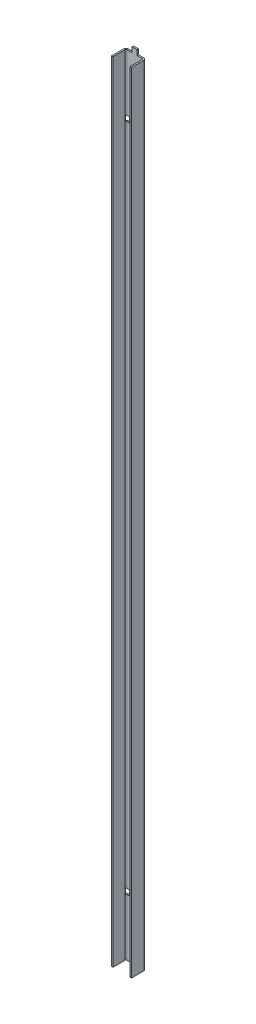
ISO-10303-21;
HEADER;
FILE_DESCRIPTION(('STEP AP214'),'2;1');
FILE_NAME('part.step','',(''),(''),'','','');
FILE_SCHEMA(('AUTOMOTIVE_DESIGN { 1 0 10303 214 1 1 1 1 }'));
ENDSEC;
DATA;
#1=APPLICATION_CONTEXT('core data for automotive mechanical design processes');
#2=APPLICATION_PROTOCOL_DEFINITION('international standard','automotive_design',2000,#1);
#3=PRODUCT_CONTEXT('',#1,'mechanical');
#4=PRODUCT('Part','Part','',(#3));
#5=PRODUCT_RELATED_PRODUCT_CATEGORY('part','',(#4));
#6=PRODUCT_DEFINITION_FORMATION('','',#4);
#7=PRODUCT_DEFINITION_CONTEXT('part definition',#1,'design');
#8=PRODUCT_DEFINITION('design','',#6,#7);
#9=PRODUCT_DEFINITION_SHAPE('','',#8);
#10=(LENGTH_UNIT() NAMED_UNIT(*) SI_UNIT(.MILLI.,.METRE.));
#11=(NAMED_UNIT(*) PLANE_ANGLE_UNIT() SI_UNIT($,.RADIAN.));
#12=(NAMED_UNIT(*) SI_UNIT($,.STERADIAN.) SOLID_ANGLE_UNIT());
#13=UNCERTAINTY_MEASURE_WITH_UNIT(LENGTH_MEASURE(1.E-05),#10,'distance_accuracy_value','');
#14=(GEOMETRIC_REPRESENTATION_CONTEXT(3) GLOBAL_UNCERTAINTY_ASSIGNED_CONTEXT((#13)) GLOBAL_UNIT_ASSIGNED_CONTEXT((#10,
#11,#12)) REPRESENTATION_CONTEXT('',''));
#15=CARTESIAN_POINT('',(0.,0.,0.));
#16=DIRECTION('',(0.,0.,1.));
#17=DIRECTION('',(1.,0.,0.));
#18=AXIS2_PLACEMENT_3D('',#15,#16,#17);
#19=CARTESIAN_POINT('',(1858.18296268255,394.,1.11022302462516E-13));
#20=DIRECTION('',(0.,0.,1.));
#21=DIRECTION('',(0.,-1.,0.));
#22=AXIS2_PLACEMENT_3D('',#19,#20,#21);
#23=PLANE('',#22);
#24=DIRECTION('',(0.,1.,0.));
#25=VECTOR('',#24,1.);
#26=CARTESIAN_POINT('',(284.,394.,0.));
#27=LINE('',#26,#25);
#28=CARTESIAN_POINT('',(284.,-393.5,0.));
#29=VERTEX_POINT('',#28);
#30=CARTESIAN_POINT('',(284.,393.5,0.));
#31=VERTEX_POINT('',#30);
#32=EDGE_CURVE('E114',#29,#31,#27,.T.);
#33=ORIENTED_EDGE('',*,*,#32,.F.);
#34=DIRECTION('',(-1.,0.,0.));
#35=VECTOR('',#34,1.);
#36=CARTESIAN_POINT('',(1858.18296268255,-393.5,0.));
#37=LINE('',#36,#35);
#38=CARTESIAN_POINT('',(285.5,-393.5,0.));
#39=VERTEX_POINT('',#38);
#40=EDGE_CURVE('E675',#39,#29,#37,.T.);
#41=ORIENTED_EDGE('',*,*,#40,.F.);
#42=DIRECTION('',(0.,1.,0.));
#43=VECTOR('',#42,1.);
#44=CARTESIAN_POINT('',(285.5,394.,0.));
#45=LINE('',#44,#43);
#46=CARTESIAN_POINT('',(285.5,393.5,1.11022302462516E-13));
#47=VERTEX_POINT('',#46);
#48=EDGE_CURVE('E90',#39,#47,#45,.T.);
#49=ORIENTED_EDGE('',*,*,#48,.T.);
#50=DIRECTION('',(-1.,0.,0.));
#51=VECTOR('',#50,1.);
#52=CARTESIAN_POINT('',(1858.18296268255,393.5,1.11022302462516E-13));
#53=LINE('',#52,#51);
#54=EDGE_CURVE('E107',#47,#31,#53,.T.);
#55=ORIENTED_EDGE('',*,*,#54,.T.);
#56=EDGE_LOOP('',(#33,#41,#49,#55));
#57=FACE_BOUND('',#56,.T.);
#58=ADVANCED_FACE('F65',(#57),#23,.T.);
#59=CARTESIAN_POINT('',(1858.18296268255,393.5,-11.9999999999999));
#60=DIRECTION('',(0.,-1.,0.));
#61=DIRECTION('',(0.,0.,-1.));
#62=AXIS2_PLACEMENT_3D('',#59,#60,#61);
#63=PLANE('',#62);
#64=DIRECTION('',(-1.,0.,0.));
#65=VECTOR('',#64,1.);
#66=CARTESIAN_POINT('',(1858.18296268255,393.5,-11.9999999999999));
#67=LINE('',#66,#65);
#68=CARTESIAN_POINT('',(285.5,393.5,-12.));
#69=VERTEX_POINT('',#68);
#70=CARTESIAN_POINT('',(284.,393.5,-11.9999999999999));
#71=VERTEX_POINT('',#70);
#72=EDGE_CURVE('E683',#69,#71,#67,.T.);
#73=ORIENTED_EDGE('',*,*,#72,.T.);
#74=DIRECTION('',(0.,0.,-1.));
#75=VECTOR('',#74,1.);
#76=CARTESIAN_POINT('',(284.,393.5,-12.));
#77=LINE('',#76,#75);
#78=EDGE_CURVE('E688',#31,#71,#77,.T.);
#79=ORIENTED_EDGE('',*,*,#78,.F.);
#80=ORIENTED_EDGE('',*,*,#54,.F.);
#81=DIRECTION('',(0.,0.,-1.));
#82=VECTOR('',#81,1.);
#83=CARTESIAN_POINT('',(285.5,393.5,-12.));
#84=LINE('',#83,#82);
#85=EDGE_CURVE('E13',#69,#47,#84,.F.);
#86=ORIENTED_EDGE('',*,*,#85,.F.);
#87=EDGE_LOOP('',(#73,#79,#80,#86));
#88=FACE_BOUND('',#87,.T.);
#89=ADVANCED_FACE('F851',(#88),#63,.F.);
#90=CARTESIAN_POINT('',(284.,394.,-14.5));
#91=DIRECTION('',(1.,0.,0.));
#92=DIRECTION('',(0.,0.,1.));
#93=AXIS2_PLACEMENT_3D('',#90,#91,#92);
#94=PLANE('',#93);
#95=DIRECTION('',(0.,0.,1.));
#96=VECTOR('',#95,1.);
#97=CARTESIAN_POINT('',(284.,-393.5,-12.));
#98=LINE('',#97,#96);
#99=CARTESIAN_POINT('',(284.,-393.5,-12.));
#100=VERTEX_POINT('',#99);
#101=EDGE_CURVE('E680',#100,#29,#98,.T.);
#102=ORIENTED_EDGE('',*,*,#101,.T.);
#103=ORIENTED_EDGE('',*,*,#32,.T.);
#104=ORIENTED_EDGE('',*,*,#78,.T.);
#105=DIRECTION('',(0.,-1.,0.));
#106=VECTOR('',#105,1.);
#107=CARTESIAN_POINT('',(284.,394.,-12.));
#108=LINE('',#107,#106);
#109=EDGE_CURVE('E703',#71,#100,#108,.T.);
#110=ORIENTED_EDGE('',*,*,#109,.T.);
#111=EDGE_LOOP('',(#102,#103,#104,#110));
#112=FACE_BOUND('',#111,.T.);
#113=ADVANCED_FACE('F856',(#112),#94,.F.);
#114=CARTESIAN_POINT('',(1858.18296268255,-393.5,-11.9999999999999));
#115=DIRECTION('',(0.,1.,0.));
#116=DIRECTION('',(0.,0.,1.));
#117=AXIS2_PLACEMENT_3D('',#114,#115,#116);
#118=PLANE('',#117);
#119=ORIENTED_EDGE('',*,*,#40,.T.);
#120=ORIENTED_EDGE('',*,*,#101,.F.);
#121=DIRECTION('',(-1.,0.,0.));
#122=VECTOR('',#121,1.);
#123=CARTESIAN_POINT('',(1858.18296268255,-393.5,-12.));
#124=LINE('',#123,#122);
#125=CARTESIAN_POINT('',(285.5,-393.5,-12.));
#126=VERTEX_POINT('',#125);
#127=EDGE_CURVE('E650',#126,#100,#124,.T.);
#128=ORIENTED_EDGE('',*,*,#127,.F.);
#129=DIRECTION('',(0.,0.,1.));
#130=VECTOR('',#129,1.);
#131=CARTESIAN_POINT('',(285.5,-393.5,-12.));
#132=LINE('',#131,#130);
#133=EDGE_CURVE('E78',#39,#126,#132,.F.);
#134=ORIENTED_EDGE('',*,*,#133,.F.);
#135=EDGE_LOOP('',(#119,#120,#128,#134));
#136=FACE_BOUND('',#135,.T.);
#137=ADVANCED_FACE('F678',(#136),#118,.F.);
#138=CARTESIAN_POINT('',(285.5,394.,-14.5));
#139=DIRECTION('',(1.,0.,0.));
#140=DIRECTION('',(0.,0.,1.));
#141=AXIS2_PLACEMENT_3D('',#138,#139,#140);
#142=PLANE('',#141);
#143=ORIENTED_EDGE('',*,*,#133,.T.);
#144=DIRECTION('',(0.,-1.,0.));
#145=VECTOR('',#144,1.);
#146=CARTESIAN_POINT('',(285.5,394.,-12.));
#147=LINE('',#146,#145);
#148=EDGE_CURVE('E70',#69,#126,#147,.T.);
#149=ORIENTED_EDGE('',*,*,#148,.F.);
#150=ORIENTED_EDGE('',*,*,#85,.T.);
#151=ORIENTED_EDGE('',*,*,#48,.F.);
#152=EDGE_LOOP('',(#143,#149,#150,#151));
#153=FACE_BOUND('',#152,.T.);
#154=ADVANCED_FACE('F68',(#153),#142,.T.);
#155=CARTESIAN_POINT('',(-1270.18296268255,394.,0.));
#156=DIRECTION('',(0.,0.,1.));
#157=DIRECTION('',(1.,0.,0.));
#158=AXIS2_PLACEMENT_3D('',#155,#156,#157);
#159=PLANE('',#158);
#160=DIRECTION('',(0.,1.,0.));
#161=VECTOR('',#160,1.);
#162=CARTESIAN_POINT('',(304.,394.,0.));
#163=LINE('',#162,#161);
#164=CARTESIAN_POINT('',(304.,393.5,0.));
#165=VERTEX_POINT('',#164);
#166=CARTESIAN_POINT('',(304.,-393.5,0.));
#167=VERTEX_POINT('',#166);
#168=EDGE_CURVE('E151',#165,#167,#163,.F.);
#169=ORIENTED_EDGE('',*,*,#168,.F.);
#170=DIRECTION('',(1.,0.,0.));
#171=VECTOR('',#170,1.);
#172=CARTESIAN_POINT('',(-1270.18296268255,393.5,0.));
#173=LINE('',#172,#171);
#174=CARTESIAN_POINT('',(302.5,393.5,0.));
#175=VERTEX_POINT('',#174);
#176=EDGE_CURVE('E895',#175,#165,#173,.T.);
#177=ORIENTED_EDGE('',*,*,#176,.F.);
#178=DIRECTION('',(0.,1.,0.));
#179=VECTOR('',#178,1.);
#180=CARTESIAN_POINT('',(302.5,394.,0.));
#181=LINE('',#180,#179);
#182=CARTESIAN_POINT('',(302.5,-393.5,0.));
#183=VERTEX_POINT('',#182);
#184=EDGE_CURVE('E126',#175,#183,#181,.F.);
#185=ORIENTED_EDGE('',*,*,#184,.T.);
#186=DIRECTION('',(1.,0.,0.));
#187=VECTOR('',#186,1.);
#188=CARTESIAN_POINT('',(-1270.18296268255,-393.5,0.));
#189=LINE('',#188,#187);
#190=EDGE_CURVE('E915',#183,#167,#189,.T.);
#191=ORIENTED_EDGE('',*,*,#190,.T.);
#192=EDGE_LOOP('',(#169,#177,#185,#191));
#193=FACE_BOUND('',#192,.T.);
#194=ADVANCED_FACE('F870',(#193),#159,.T.);
#195=CARTESIAN_POINT('',(-1270.18296268255,-393.5,-12.0000000000001));
#196=DIRECTION('',(0.,1.,0.));
#197=DIRECTION('',(-1.,0.,0.));
#198=AXIS2_PLACEMENT_3D('',#195,#196,#197);
#199=PLANE('',#198);
#200=DIRECTION('',(1.,0.,0.));
#201=VECTOR('',#200,1.);
#202=CARTESIAN_POINT('',(-1270.18296268255,-393.5,-12.0000000000001));
#203=LINE('',#202,#201);
#204=CARTESIAN_POINT('',(302.5,-393.5,-12.));
#205=VERTEX_POINT('',#204);
#206=CARTESIAN_POINT('',(304.,-393.5,-12.));
#207=VERTEX_POINT('',#206);
#208=EDGE_CURVE('E912',#205,#207,#203,.T.);
#209=ORIENTED_EDGE('',*,*,#208,.T.);
#210=DIRECTION('',(0.,0.,1.));
#211=VECTOR('',#210,1.);
#212=CARTESIAN_POINT('',(304.,-393.5,-12.));
#213=LINE('',#212,#211);
#214=EDGE_CURVE('E144',#167,#207,#213,.F.);
#215=ORIENTED_EDGE('',*,*,#214,.F.);
#216=ORIENTED_EDGE('',*,*,#190,.F.);
#217=DIRECTION('',(0.,0.,1.));
#218=VECTOR('',#217,1.);
#219=CARTESIAN_POINT('',(302.5,-393.5,-12.));
#220=LINE('',#219,#218);
#221=EDGE_CURVE('E639',#205,#183,#220,.T.);
#222=ORIENTED_EDGE('',*,*,#221,.F.);
#223=EDGE_LOOP('',(#209,#215,#216,#222));
#224=FACE_BOUND('',#223,.T.);
#225=ADVANCED_FACE('F874',(#224),#199,.F.);
#226=CARTESIAN_POINT('',(304.,394.,0.));
#227=DIRECTION('',(-1.,0.,0.));
#228=DIRECTION('',(0.,0.,-1.));
#229=AXIS2_PLACEMENT_3D('',#226,#227,#228);
#230=PLANE('',#229);
#231=ORIENTED_EDGE('',*,*,#214,.T.);
#232=DIRECTION('',(0.,-1.,0.));
#233=VECTOR('',#232,1.);
#234=CARTESIAN_POINT('',(304.,394.,-12.));
#235=LINE('',#234,#233);
#236=CARTESIAN_POINT('',(304.,393.5,-12.));
#237=VERTEX_POINT('',#236);
#238=EDGE_CURVE('E902',#207,#237,#235,.F.);
#239=ORIENTED_EDGE('',*,*,#238,.T.);
#240=DIRECTION('',(0.,0.,-1.));
#241=VECTOR('',#240,1.);
#242=CARTESIAN_POINT('',(304.,393.5,-12.));
#243=LINE('',#242,#241);
#244=EDGE_CURVE('E898',#237,#165,#243,.F.);
#245=ORIENTED_EDGE('',*,*,#244,.T.);
#246=ORIENTED_EDGE('',*,*,#168,.T.);
#247=EDGE_LOOP('',(#231,#239,#245,#246));
#248=FACE_BOUND('',#247,.T.);
#249=ADVANCED_FACE('F879',(#248),#230,.F.);
#250=CARTESIAN_POINT('',(-1270.18296268255,393.5,-12.0000000000001));
#251=DIRECTION('',(0.,-1.,0.));
#252=DIRECTION('',(1.,0.,0.));
#253=AXIS2_PLACEMENT_3D('',#250,#251,#252);
#254=PLANE('',#253);
#255=ORIENTED_EDGE('',*,*,#176,.T.);
#256=ORIENTED_EDGE('',*,*,#244,.F.);
#257=DIRECTION('',(1.,0.,0.));
#258=VECTOR('',#257,1.);
#259=CARTESIAN_POINT('',(-1270.18296268255,393.5,-12.0000000000001));
#260=LINE('',#259,#258);
#261=CARTESIAN_POINT('',(302.5,393.5,-12.));
#262=VERTEX_POINT('',#261);
#263=EDGE_CURVE('E920',#262,#237,#260,.T.);
#264=ORIENTED_EDGE('',*,*,#263,.F.);
#265=DIRECTION('',(0.,0.,-1.));
#266=VECTOR('',#265,1.);
#267=CARTESIAN_POINT('',(302.5,393.5,-12.));
#268=LINE('',#267,#266);
#269=EDGE_CURVE('E635',#175,#262,#268,.T.);
#270=ORIENTED_EDGE('',*,*,#269,.F.);
#271=EDGE_LOOP('',(#255,#256,#264,#270));
#272=FACE_BOUND('',#271,.T.);
#273=ADVANCED_FACE('F887',(#272),#254,.F.);
#274=CARTESIAN_POINT('',(302.5,394.,0.));
#275=DIRECTION('',(-1.,0.,0.));
#276=DIRECTION('',(0.,0.,-1.));
#277=AXIS2_PLACEMENT_3D('',#274,#275,#276);
#278=PLANE('',#277);
#279=ORIENTED_EDGE('',*,*,#221,.T.);
#280=ORIENTED_EDGE('',*,*,#184,.F.);
#281=ORIENTED_EDGE('',*,*,#269,.T.);
#282=DIRECTION('',(0.,-1.,0.));
#283=VECTOR('',#282,1.);
#284=CARTESIAN_POINT('',(302.5,394.,-12.));
#285=LINE('',#284,#283);
#286=EDGE_CURVE('E634',#205,#262,#285,.F.);
#287=ORIENTED_EDGE('',*,*,#286,.F.);
#288=EDGE_LOOP('',(#279,#280,#281,#287));
#289=FACE_BOUND('',#288,.T.);
#290=ADVANCED_FACE('F861',(#289),#278,.T.);
#291=CARTESIAN_POINT('',(304.,394.,-13.));
#292=DIRECTION('',(0.,0.,1.));
#293=DIRECTION('',(-1.,0.,0.));
#294=AXIS2_PLACEMENT_3D('',#291,#292,#293);
#295=PLANE('',#294);
#296=DIRECTION('',(0.,1.,0.));
#297=VECTOR('',#296,1.);
#298=CARTESIAN_POINT('',(286.5,394.,-13.));
#299=LINE('',#298,#297);
#300=CARTESIAN_POINT('',(286.5,-393.5,-13.));
#301=VERTEX_POINT('',#300);
#302=CARTESIAN_POINT('',(286.5,-336.7,-13.));
#303=VERTEX_POINT('',#302);
#304=EDGE_CURVE('E416',#301,#303,#299,.T.);
#305=ORIENTED_EDGE('',*,*,#304,.F.);
#306=DIRECTION('',(-1.,0.,0.));
#307=VECTOR('',#306,1.);
#308=CARTESIAN_POINT('',(304.,-393.5,-13.));
#309=LINE('',#308,#307);
#310=CARTESIAN_POINT('',(291.5,-393.5,-13.));
#311=VERTEX_POINT('',#310);
#312=EDGE_CURVE('E422',#311,#301,#309,.T.);
#313=ORIENTED_EDGE('',*,*,#312,.F.);
#314=DIRECTION('',(0.,-1.,0.));
#315=VECTOR('',#314,1.);
#316=CARTESIAN_POINT('',(291.5,-393.5,-13.));
#317=LINE('',#316,#315);
#318=CARTESIAN_POINT('',(291.5,-398.5,-13.));
#319=VERTEX_POINT('',#318);
#320=EDGE_CURVE('E509',#311,#319,#317,.T.);
#321=ORIENTED_EDGE('',*,*,#320,.T.);
#322=DIRECTION('',(1.,0.,0.));
#323=VECTOR('',#322,1.);
#324=CARTESIAN_POINT('',(291.5,-398.5,-13.));
#325=LINE('',#324,#323);
#326=CARTESIAN_POINT('',(296.5,-398.5,-13.));
#327=VERTEX_POINT('',#326);
#328=EDGE_CURVE('E991',#319,#327,#325,.T.);
#329=ORIENTED_EDGE('',*,*,#328,.T.);
#330=DIRECTION('',(0.,1.,0.));
#331=VECTOR('',#330,1.);
#332=CARTESIAN_POINT('',(296.5,-393.5,-13.));
#333=LINE('',#332,#331);
#334=CARTESIAN_POINT('',(296.5,-393.5,-13.));
#335=VERTEX_POINT('',#334);
#336=EDGE_CURVE('E1001',#327,#335,#333,.T.);
#337=ORIENTED_EDGE('',*,*,#336,.T.);
#338=CARTESIAN_POINT('',(301.5,-393.5,-13.));
#339=VERTEX_POINT('',#338);
#340=EDGE_CURVE('E510',#339,#335,#309,.T.);
#341=ORIENTED_EDGE('',*,*,#340,.F.);
#342=DIRECTION('',(0.,1.,0.));
#343=VECTOR('',#342,1.);
#344=CARTESIAN_POINT('',(301.5,394.,-13.));
#345=LINE('',#344,#343);
#346=CARTESIAN_POINT('',(301.5,393.5,-13.));
#347=VERTEX_POINT('',#346);
#348=EDGE_CURVE('E1000',#347,#339,#345,.F.);
#349=ORIENTED_EDGE('',*,*,#348,.F.);
#350=DIRECTION('',(-1.,0.,0.));
#351=VECTOR('',#350,1.);
#352=CARTESIAN_POINT('',(304.,393.5,-13.));
#353=LINE('',#352,#351);
#354=CARTESIAN_POINT('',(296.5,393.5,-13.));
#355=VERTEX_POINT('',#354);
#356=EDGE_CURVE('E527',#355,#347,#353,.F.);
#357=ORIENTED_EDGE('',*,*,#356,.F.);
#358=DIRECTION('',(0.,1.,0.));
#359=VECTOR('',#358,1.);
#360=CARTESIAN_POINT('',(296.5,393.5,-13.));
#361=LINE('',#360,#359);
#362=CARTESIAN_POINT('',(296.5,398.5,-13.));
#363=VERTEX_POINT('',#362);
#364=EDGE_CURVE('E522',#355,#363,#361,.T.);
#365=ORIENTED_EDGE('',*,*,#364,.T.);
#366=DIRECTION('',(-1.,0.,0.));
#367=VECTOR('',#366,1.);
#368=CARTESIAN_POINT('',(296.5,398.5,-13.));
#369=LINE('',#368,#367);
#370=CARTESIAN_POINT('',(291.5,398.5,-13.));
#371=VERTEX_POINT('',#370);
#372=EDGE_CURVE('E526',#363,#371,#369,.T.);
#373=ORIENTED_EDGE('',*,*,#372,.T.);
#374=DIRECTION('',(0.,-1.,0.));
#375=VECTOR('',#374,1.);
#376=CARTESIAN_POINT('',(291.5,393.5,-13.));
#377=LINE('',#376,#375);
#378=CARTESIAN_POINT('',(291.5,393.5,-13.));
#379=VERTEX_POINT('',#378);
#380=EDGE_CURVE('E532',#371,#379,#377,.T.);
#381=ORIENTED_EDGE('',*,*,#380,.T.);
#382=CARTESIAN_POINT('',(286.5,393.5,-13.));
#383=VERTEX_POINT('',#382);
#384=EDGE_CURVE('E536',#383,#379,#353,.F.);
#385=ORIENTED_EDGE('',*,*,#384,.F.);
#386=CARTESIAN_POINT('',(286.5,336.7,-13.));
#387=VERTEX_POINT('',#386);
#388=EDGE_CURVE('E425',#387,#383,#299,.T.);
#389=ORIENTED_EDGE('',*,*,#388,.F.);
#390=DIRECTION('',(-1.,0.,0.));
#391=VECTOR('',#390,1.);
#392=CARTESIAN_POINT('',(304.,336.7,-13.));
#393=LINE('',#392,#391);
#394=CARTESIAN_POINT('',(289.,336.7,-13.));
#395=VERTEX_POINT('',#394);
#396=EDGE_CURVE('E537',#395,#387,#393,.T.);
#397=ORIENTED_EDGE('',*,*,#396,.F.);
#398=DIRECTION('',(0.,1.,0.));
#399=VECTOR('',#398,1.);
#400=CARTESIAN_POINT('',(289.,394.,-13.));
#401=LINE('',#400,#399);
#402=CARTESIAN_POINT('',(289.,331.3,-13.));
#403=VERTEX_POINT('',#402);
#404=EDGE_CURVE('E545',#403,#395,#401,.T.);
#405=ORIENTED_EDGE('',*,*,#404,.F.);
#406=DIRECTION('',(1.,0.,0.));
#407=VECTOR('',#406,1.);
#408=CARTESIAN_POINT('',(304.,331.3,-13.));
#409=LINE('',#408,#407);
#410=CARTESIAN_POINT('',(286.5,331.3,-13.));
#411=VERTEX_POINT('',#410);
#412=EDGE_CURVE('E549',#411,#403,#409,.T.);
#413=ORIENTED_EDGE('',*,*,#412,.F.);
#414=CARTESIAN_POINT('',(286.5,-331.3,-13.));
#415=VERTEX_POINT('',#414);
#416=EDGE_CURVE('E424',#415,#411,#299,.T.);
#417=ORIENTED_EDGE('',*,*,#416,.F.);
#418=DIRECTION('',(-1.,0.,0.));
#419=VECTOR('',#418,1.);
#420=CARTESIAN_POINT('',(304.,-331.3,-13.));
#421=LINE('',#420,#419);
#422=CARTESIAN_POINT('',(289.,-331.3,-13.));
#423=VERTEX_POINT('',#422);
#424=EDGE_CURVE('E554',#423,#415,#421,.T.);
#425=ORIENTED_EDGE('',*,*,#424,.F.);
#426=DIRECTION('',(0.,1.,0.));
#427=VECTOR('',#426,1.);
#428=CARTESIAN_POINT('',(289.,394.,-13.));
#429=LINE('',#428,#427);
#430=CARTESIAN_POINT('',(289.,-336.7,-12.9999999999995));
#431=VERTEX_POINT('',#430);
#432=EDGE_CURVE('E559',#431,#423,#429,.T.);
#433=ORIENTED_EDGE('',*,*,#432,.F.);
#434=DIRECTION('',(1.,0.,0.));
#435=VECTOR('',#434,1.);
#436=CARTESIAN_POINT('',(304.,-336.7,-13.));
#437=LINE('',#436,#435);
#438=EDGE_CURVE('E389',#303,#431,#437,.T.);
#439=ORIENTED_EDGE('',*,*,#438,.F.);
#440=EDGE_LOOP('',(#305,#313,#321,#329,#337,#341,#349,#357,#365,#373,#381,#385,#389,#397,#405,
#413,#417,#425,#433,#439));
#441=FACE_BOUND('',#440,.T.);
#442=ADVANCED_FACE('F813',(#441),#295,.T.);
#443=CARTESIAN_POINT('',(304.,-393.5,1579.78228366246));
#444=DIRECTION('',(0.,-1.,0.));
#445=DIRECTION('',(0.,0.,-1.));
#446=AXIS2_PLACEMENT_3D('',#443,#444,#445);
#447=PLANE('',#446);
#448=DIRECTION('',(1.,0.,0.));
#449=VECTOR('',#448,1.);
#450=CARTESIAN_POINT('',(302.5,-393.5,-14.5));
#451=LINE('',#450,#449);
#452=CARTESIAN_POINT('',(291.5,-393.5,-14.4999999999995));
#453=VERTEX_POINT('',#452);
#454=CARTESIAN_POINT('',(286.5,-393.5,-14.5));
#455=VERTEX_POINT('',#454);
#456=EDGE_CURVE('E159',#453,#455,#451,.F.);
#457=ORIENTED_EDGE('',*,*,#456,.F.);
#458=DIRECTION('',(0.,0.,-1.));
#459=VECTOR('',#458,1.);
#460=CARTESIAN_POINT('',(291.5,-393.5,1579.78228366246));
#461=LINE('',#460,#459);
#462=EDGE_CURVE('E628',#311,#453,#461,.T.);
#463=ORIENTED_EDGE('',*,*,#462,.F.);
#464=ORIENTED_EDGE('',*,*,#312,.T.);
#465=DIRECTION('',(0.,0.,-1.));
#466=VECTOR('',#465,1.);
#467=CARTESIAN_POINT('',(286.5,-393.5,1579.78228366246));
#468=LINE('',#467,#466);
#469=EDGE_CURVE('E631',#301,#455,#468,.T.);
#470=ORIENTED_EDGE('',*,*,#469,.T.);
#471=EDGE_LOOP('',(#457,#463,#464,#470));
#472=FACE_BOUND('',#471,.T.);
#473=ADVANCED_FACE('F975',(#472),#447,.T.);
#474=CARTESIAN_POINT('',(291.5,-393.5,1579.78228366246));
#475=DIRECTION('',(1.,0.,0.));
#476=DIRECTION('',(0.,0.,-1.));
#477=AXIS2_PLACEMENT_3D('',#474,#475,#476);
#478=PLANE('',#477);
#479=ORIENTED_EDGE('',*,*,#462,.T.);
#480=DIRECTION('',(0.,-1.,0.));
#481=VECTOR('',#480,1.);
#482=CARTESIAN_POINT('',(291.5,-393.5,-14.5));
#483=LINE('',#482,#481);
#484=CARTESIAN_POINT('',(291.5,-398.5,-14.4999999999995));
#485=VERTEX_POINT('',#484);
#486=EDGE_CURVE('E166',#453,#485,#483,.T.);
#487=ORIENTED_EDGE('',*,*,#486,.T.);
#488=DIRECTION('',(0.,0.,-1.));
#489=VECTOR('',#488,1.);
#490=CARTESIAN_POINT('',(291.5,-398.5,1579.78228366246));
#491=LINE('',#490,#489);
#492=EDGE_CURVE('E625',#319,#485,#491,.T.);
#493=ORIENTED_EDGE('',*,*,#492,.F.);
#494=ORIENTED_EDGE('',*,*,#320,.F.);
#495=EDGE_LOOP('',(#479,#487,#493,#494));
#496=FACE_BOUND('',#495,.T.);
#497=ADVANCED_FACE('F882',(#496),#478,.F.);
#498=CARTESIAN_POINT('',(291.5,-398.5,1579.78228366246));
#499=DIRECTION('',(0.,1.,0.));
#500=DIRECTION('',(0.,0.,1.));
#501=AXIS2_PLACEMENT_3D('',#498,#499,#500);
#502=PLANE('',#501);
#503=ORIENTED_EDGE('',*,*,#492,.T.);
#504=DIRECTION('',(1.,0.,0.));
#505=VECTOR('',#504,1.);
#506=CARTESIAN_POINT('',(291.5,-398.5,-14.5));
#507=LINE('',#506,#505);
#508=CARTESIAN_POINT('',(296.5,-398.5,-14.4999999999995));
#509=VERTEX_POINT('',#508);
#510=EDGE_CURVE('E494',#485,#509,#507,.T.);
#511=ORIENTED_EDGE('',*,*,#510,.T.);
#512=DIRECTION('',(0.,0.,-1.));
#513=VECTOR('',#512,1.);
#514=CARTESIAN_POINT('',(296.5,-398.5,1579.78228366246));
#515=LINE('',#514,#513);
#516=EDGE_CURVE('E621',#327,#509,#515,.T.);
#517=ORIENTED_EDGE('',*,*,#516,.F.);
#518=ORIENTED_EDGE('',*,*,#328,.F.);
#519=EDGE_LOOP('',(#503,#511,#517,#518));
#520=FACE_BOUND('',#519,.T.);
#521=ADVANCED_FACE('F981',(#520),#502,.F.);
#522=CARTESIAN_POINT('',(296.5,-393.5,1579.78228366246));
#523=DIRECTION('',(-1.,0.,0.));
#524=DIRECTION('',(0.,0.,1.));
#525=AXIS2_PLACEMENT_3D('',#522,#523,#524);
#526=PLANE('',#525);
#527=ORIENTED_EDGE('',*,*,#516,.T.);
#528=DIRECTION('',(0.,1.,0.));
#529=VECTOR('',#528,1.);
#530=CARTESIAN_POINT('',(296.5,-393.5,-14.5));
#531=LINE('',#530,#529);
#532=CARTESIAN_POINT('',(296.5,-393.5,-14.4999999999995));
#533=VERTEX_POINT('',#532);
#534=EDGE_CURVE('E491',#509,#533,#531,.T.);
#535=ORIENTED_EDGE('',*,*,#534,.T.);
#536=DIRECTION('',(0.,0.,-1.));
#537=VECTOR('',#536,1.);
#538=CARTESIAN_POINT('',(296.5,-393.5,1579.78228366246));
#539=LINE('',#538,#537);
#540=EDGE_CURVE('E617',#335,#533,#539,.T.);
#541=ORIENTED_EDGE('',*,*,#540,.F.);
#542=ORIENTED_EDGE('',*,*,#336,.F.);
#543=EDGE_LOOP('',(#527,#535,#541,#542));
#544=FACE_BOUND('',#543,.T.);
#545=ADVANCED_FACE('F979',(#544),#526,.F.);
#546=CARTESIAN_POINT('',(301.5,-393.5,-14.5));
#547=VERTEX_POINT('',#546);
#548=EDGE_CURVE('E428',#547,#533,#451,.F.);
#549=ORIENTED_EDGE('',*,*,#548,.F.);
#550=DIRECTION('',(0.,0.,-1.));
#551=VECTOR('',#550,1.);
#552=CARTESIAN_POINT('',(301.5,-393.5,1579.78228366246));
#553=LINE('',#552,#551);
#554=EDGE_CURVE('E613',#339,#547,#553,.T.);
#555=ORIENTED_EDGE('',*,*,#554,.F.);
#556=ORIENTED_EDGE('',*,*,#340,.T.);
#557=ORIENTED_EDGE('',*,*,#540,.T.);
#558=EDGE_LOOP('',(#549,#555,#556,#557));
#559=FACE_BOUND('',#558,.T.);
#560=ADVANCED_FACE('F978',(#559),#447,.T.);
#561=CARTESIAN_POINT('',(304.,393.5,1579.78228366246));
#562=DIRECTION('',(0.,1.,0.));
#563=DIRECTION('',(0.,0.,1.));
#564=AXIS2_PLACEMENT_3D('',#561,#562,#563);
#565=PLANE('',#564);
#566=DIRECTION('',(1.,0.,0.));
#567=VECTOR('',#566,1.);
#568=CARTESIAN_POINT('',(285.5,393.5,-14.5));
#569=LINE('',#568,#567);
#570=CARTESIAN_POINT('',(296.5,393.5,-14.4999999999995));
#571=VERTEX_POINT('',#570);
#572=CARTESIAN_POINT('',(301.5,393.5,-14.4999999999995));
#573=VERTEX_POINT('',#572);
#574=EDGE_CURVE('E483',#571,#573,#569,.T.);
#575=ORIENTED_EDGE('',*,*,#574,.F.);
#576=DIRECTION('',(0.,0.,-1.));
#577=VECTOR('',#576,1.);
#578=CARTESIAN_POINT('',(296.5,393.5,1579.78228366246));
#579=LINE('',#578,#577);
#580=EDGE_CURVE('E606',#355,#571,#579,.T.);
#581=ORIENTED_EDGE('',*,*,#580,.F.);
#582=ORIENTED_EDGE('',*,*,#356,.T.);
#583=DIRECTION('',(0.,0.,-1.));
#584=VECTOR('',#583,1.);
#585=CARTESIAN_POINT('',(301.5,393.5,1579.78228366246));
#586=LINE('',#585,#584);
#587=EDGE_CURVE('E610',#347,#573,#586,.T.);
#588=ORIENTED_EDGE('',*,*,#587,.T.);
#589=EDGE_LOOP('',(#575,#581,#582,#588));
#590=FACE_BOUND('',#589,.T.);
#591=ADVANCED_FACE('F849',(#590),#565,.T.);
#592=CARTESIAN_POINT('',(296.5,393.5,1579.78228366246));
#593=DIRECTION('',(-1.,0.,0.));
#594=DIRECTION('',(0.,0.,1.));
#595=AXIS2_PLACEMENT_3D('',#592,#593,#594);
#596=PLANE('',#595);
#597=ORIENTED_EDGE('',*,*,#580,.T.);
#598=DIRECTION('',(0.,1.,0.));
#599=VECTOR('',#598,1.);
#600=CARTESIAN_POINT('',(296.5,393.5,-14.5));
#601=LINE('',#600,#599);
#602=CARTESIAN_POINT('',(296.5,398.5,-14.4999999999995));
#603=VERTEX_POINT('',#602);
#604=EDGE_CURVE('E479',#571,#603,#601,.T.);
#605=ORIENTED_EDGE('',*,*,#604,.T.);
#606=DIRECTION('',(0.,0.,-1.));
#607=VECTOR('',#606,1.);
#608=CARTESIAN_POINT('',(296.5,398.5,1579.78228366246));
#609=LINE('',#608,#607);
#610=EDGE_CURVE('E602',#363,#603,#609,.T.);
#611=ORIENTED_EDGE('',*,*,#610,.F.);
#612=ORIENTED_EDGE('',*,*,#364,.F.);
#613=EDGE_LOOP('',(#597,#605,#611,#612));
#614=FACE_BOUND('',#613,.T.);
#615=ADVANCED_FACE('F959',(#614),#596,.F.);
#616=CARTESIAN_POINT('',(296.5,398.5,1579.78228366246));
#617=DIRECTION('',(0.,-1.,0.));
#618=DIRECTION('',(0.,0.,-1.));
#619=AXIS2_PLACEMENT_3D('',#616,#617,#618);
#620=PLANE('',#619);
#621=ORIENTED_EDGE('',*,*,#610,.T.);
#622=DIRECTION('',(-1.,0.,0.));
#623=VECTOR('',#622,1.);
#624=CARTESIAN_POINT('',(296.5,398.5,-14.5));
#625=LINE('',#624,#623);
#626=CARTESIAN_POINT('',(291.5,398.5,-14.4999999999995));
#627=VERTEX_POINT('',#626);
#628=EDGE_CURVE('E475',#603,#627,#625,.T.);
#629=ORIENTED_EDGE('',*,*,#628,.T.);
#630=DIRECTION('',(0.,0.,-1.));
#631=VECTOR('',#630,1.);
#632=CARTESIAN_POINT('',(291.5,398.5,1579.78228366246));
#633=LINE('',#632,#631);
#634=EDGE_CURVE('E598',#371,#627,#633,.T.);
#635=ORIENTED_EDGE('',*,*,#634,.F.);
#636=ORIENTED_EDGE('',*,*,#372,.F.);
#637=EDGE_LOOP('',(#621,#629,#635,#636));
#638=FACE_BOUND('',#637,.T.);
#639=ADVANCED_FACE('F964',(#638),#620,.F.);
#640=CARTESIAN_POINT('',(291.5,393.5,1579.78228366246));
#641=DIRECTION('',(1.,0.,0.));
#642=DIRECTION('',(0.,0.,-1.));
#643=AXIS2_PLACEMENT_3D('',#640,#641,#642);
#644=PLANE('',#643);
#645=ORIENTED_EDGE('',*,*,#634,.T.);
#646=DIRECTION('',(0.,-1.,0.));
#647=VECTOR('',#646,1.);
#648=CARTESIAN_POINT('',(291.5,393.5,-14.5));
#649=LINE('',#648,#647);
#650=CARTESIAN_POINT('',(291.5,393.5,-14.4999999999995));
#651=VERTEX_POINT('',#650);
#652=EDGE_CURVE('E472',#627,#651,#649,.T.);
#653=ORIENTED_EDGE('',*,*,#652,.T.);
#654=DIRECTION('',(0.,0.,-1.));
#655=VECTOR('',#654,1.);
#656=CARTESIAN_POINT('',(291.5,393.5,1579.78228366246));
#657=LINE('',#656,#655);
#658=EDGE_CURVE('E594',#379,#651,#657,.T.);
#659=ORIENTED_EDGE('',*,*,#658,.F.);
#660=ORIENTED_EDGE('',*,*,#380,.F.);
#661=EDGE_LOOP('',(#645,#653,#659,#660));
#662=FACE_BOUND('',#661,.T.);
#663=ADVANCED_FACE('F847',(#662),#644,.F.);
#664=CARTESIAN_POINT('',(286.5,393.5,-14.4999999999995));
#665=VERTEX_POINT('',#664);
#666=EDGE_CURVE('E433',#665,#651,#569,.T.);
#667=ORIENTED_EDGE('',*,*,#666,.F.);
#668=DIRECTION('',(0.,0.,-1.));
#669=VECTOR('',#668,1.);
#670=CARTESIAN_POINT('',(286.5,393.5,1579.78228366246));
#671=LINE('',#670,#669);
#672=EDGE_CURVE('E590',#383,#665,#671,.T.);
#673=ORIENTED_EDGE('',*,*,#672,.F.);
#674=ORIENTED_EDGE('',*,*,#384,.T.);
#675=ORIENTED_EDGE('',*,*,#658,.T.);
#676=EDGE_LOOP('',(#667,#673,#674,#675));
#677=FACE_BOUND('',#676,.T.);
#678=ADVANCED_FACE('F810',(#677),#565,.T.);
#679=CARTESIAN_POINT('',(304.,336.7,1579.78228366246));
#680=DIRECTION('',(0.,-1.,0.));
#681=DIRECTION('',(0.,0.,-1.));
#682=AXIS2_PLACEMENT_3D('',#679,#680,#681);
#683=PLANE('',#682);
#684=DIRECTION('',(-1.,0.,0.));
#685=VECTOR('',#684,1.);
#686=CARTESIAN_POINT('',(304.,336.7,-14.5));
#687=LINE('',#686,#685);
#688=CARTESIAN_POINT('',(289.,336.7,-14.4999999999995));
#689=VERTEX_POINT('',#688);
#690=CARTESIAN_POINT('',(286.5,336.7,-14.5));
#691=VERTEX_POINT('',#690);
#692=EDGE_CURVE('E434',#689,#691,#687,.T.);
#693=ORIENTED_EDGE('',*,*,#692,.F.);
#694=DIRECTION('',(0.,0.,-1.));
#695=VECTOR('',#694,1.);
#696=CARTESIAN_POINT('',(289.,336.7,1579.78228366246));
#697=LINE('',#696,#695);
#698=EDGE_CURVE('E583',#395,#689,#697,.T.);
#699=ORIENTED_EDGE('',*,*,#698,.F.);
#700=ORIENTED_EDGE('',*,*,#396,.T.);
#701=DIRECTION('',(0.,0.,-1.));
#702=VECTOR('',#701,1.);
#703=CARTESIAN_POINT('',(286.5,336.7,1579.78228366246));
#704=LINE('',#703,#702);
#705=EDGE_CURVE('E587',#387,#691,#704,.T.);
#706=ORIENTED_EDGE('',*,*,#705,.T.);
#707=EDGE_LOOP('',(#693,#699,#700,#706));
#708=FACE_BOUND('',#707,.T.);
#709=ADVANCED_FACE('F839',(#708),#683,.T.);
#710=CARTESIAN_POINT('',(289.,394.,1579.78228366246));
#711=DIRECTION('',(-1.,0.,0.));
#712=DIRECTION('',(0.,0.,1.));
#713=AXIS2_PLACEMENT_3D('',#710,#711,#712);
#714=PLANE('',#713);
#715=DIRECTION('',(0.,1.,0.));
#716=VECTOR('',#715,1.);
#717=CARTESIAN_POINT('',(289.,394.,-14.5));
#718=LINE('',#717,#716);
#719=CARTESIAN_POINT('',(289.,331.3,-14.4999999999995));
#720=VERTEX_POINT('',#719);
#721=EDGE_CURVE('E444',#720,#689,#718,.T.);
#722=ORIENTED_EDGE('',*,*,#721,.F.);
#723=DIRECTION('',(0.,0.,-1.));
#724=VECTOR('',#723,1.);
#725=CARTESIAN_POINT('',(289.,331.3,1579.78228366246));
#726=LINE('',#725,#724);
#727=EDGE_CURVE('E579',#403,#720,#726,.T.);
#728=ORIENTED_EDGE('',*,*,#727,.F.);
#729=ORIENTED_EDGE('',*,*,#404,.T.);
#730=ORIENTED_EDGE('',*,*,#698,.T.);
#731=EDGE_LOOP('',(#722,#728,#729,#730));
#732=FACE_BOUND('',#731,.T.);
#733=ADVANCED_FACE('F836',(#732),#714,.T.);
#734=CARTESIAN_POINT('',(304.,331.3,1579.78228366246));
#735=DIRECTION('',(0.,1.,0.));
#736=DIRECTION('',(0.,0.,1.));
#737=AXIS2_PLACEMENT_3D('',#734,#735,#736);
#738=PLANE('',#737);
#739=DIRECTION('',(1.,0.,0.));
#740=VECTOR('',#739,1.);
#741=CARTESIAN_POINT('',(304.,331.3,-14.5));
#742=LINE('',#741,#740);
#743=CARTESIAN_POINT('',(286.5,331.3,-14.5));
#744=VERTEX_POINT('',#743);
#745=EDGE_CURVE('E437',#744,#720,#742,.T.);
#746=ORIENTED_EDGE('',*,*,#745,.F.);
#747=DIRECTION('',(0.,0.,-1.));
#748=VECTOR('',#747,1.);
#749=CARTESIAN_POINT('',(286.5,331.3,1579.78228366246));
#750=LINE('',#749,#748);
#751=EDGE_CURVE('E576',#411,#744,#750,.T.);
#752=ORIENTED_EDGE('',*,*,#751,.F.);
#753=ORIENTED_EDGE('',*,*,#412,.T.);
#754=ORIENTED_EDGE('',*,*,#727,.T.);
#755=EDGE_LOOP('',(#746,#752,#753,#754));
#756=FACE_BOUND('',#755,.T.);
#757=ADVANCED_FACE('F834',(#756),#738,.T.);
#758=CARTESIAN_POINT('',(304.,-331.3,1579.78228366246));
#759=DIRECTION('',(0.,-1.,0.));
#760=DIRECTION('',(0.,0.,-1.));
#761=AXIS2_PLACEMENT_3D('',#758,#759,#760);
#762=PLANE('',#761);
#763=DIRECTION('',(-1.,0.,0.));
#764=VECTOR('',#763,1.);
#765=CARTESIAN_POINT('',(304.,-331.3,-14.5));
#766=LINE('',#765,#764);
#767=CARTESIAN_POINT('',(289.,-331.3,-14.4999999999995));
#768=VERTEX_POINT('',#767);
#769=CARTESIAN_POINT('',(286.5,-331.3,-14.5));
#770=VERTEX_POINT('',#769);
#771=EDGE_CURVE('E438',#768,#770,#766,.T.);
#772=ORIENTED_EDGE('',*,*,#771,.F.);
#773=DIRECTION('',(0.,0.,-1.));
#774=VECTOR('',#773,1.);
#775=CARTESIAN_POINT('',(289.,-331.3,1579.78228366246));
#776=LINE('',#775,#774);
#777=EDGE_CURVE('E568',#423,#768,#776,.T.);
#778=ORIENTED_EDGE('',*,*,#777,.F.);
#779=ORIENTED_EDGE('',*,*,#424,.T.);
#780=DIRECTION('',(0.,0.,-1.));
#781=VECTOR('',#780,1.);
#782=CARTESIAN_POINT('',(286.5,-331.3,1579.78228366246));
#783=LINE('',#782,#781);
#784=EDGE_CURVE('E572',#415,#770,#783,.T.);
#785=ORIENTED_EDGE('',*,*,#784,.T.);
#786=EDGE_LOOP('',(#772,#778,#779,#785));
#787=FACE_BOUND('',#786,.T.);
#788=ADVANCED_FACE('F1014',(#787),#762,.T.);
#789=CARTESIAN_POINT('',(289.,394.,1579.78228366246));
#790=DIRECTION('',(-1.,0.,0.));
#791=DIRECTION('',(0.,0.,1.));
#792=AXIS2_PLACEMENT_3D('',#789,#790,#791);
#793=PLANE('',#792);
#794=DIRECTION('',(0.,1.,0.));
#795=VECTOR('',#794,1.);
#796=CARTESIAN_POINT('',(289.,394.,-14.5));
#797=LINE('',#796,#795);
#798=CARTESIAN_POINT('',(289.,-336.7,-14.5));
#799=VERTEX_POINT('',#798);
#800=EDGE_CURVE('E411',#799,#768,#797,.T.);
#801=ORIENTED_EDGE('',*,*,#800,.F.);
#802=DIRECTION('',(0.,0.,-1.));
#803=VECTOR('',#802,1.);
#804=CARTESIAN_POINT('',(289.,-336.7,1579.78228366246));
#805=LINE('',#804,#803);
#806=EDGE_CURVE('E388',#431,#799,#805,.T.);
#807=ORIENTED_EDGE('',*,*,#806,.F.);
#808=ORIENTED_EDGE('',*,*,#432,.T.);
#809=ORIENTED_EDGE('',*,*,#777,.T.);
#810=EDGE_LOOP('',(#801,#807,#808,#809));
#811=FACE_BOUND('',#810,.T.);
#812=ADVANCED_FACE('F1017',(#811),#793,.T.);
#813=CARTESIAN_POINT('',(304.,-336.7,1579.78228366246));
#814=DIRECTION('',(0.,1.,0.));
#815=DIRECTION('',(0.,0.,1.));
#816=AXIS2_PLACEMENT_3D('',#813,#814,#815);
#817=PLANE('',#816);
#818=DIRECTION('',(1.,0.,0.));
#819=VECTOR('',#818,1.);
#820=CARTESIAN_POINT('',(304.,-336.7,-14.5));
#821=LINE('',#820,#819);
#822=CARTESIAN_POINT('',(286.5,-336.7,-14.5));
#823=VERTEX_POINT('',#822);
#824=EDGE_CURVE('E404',#823,#799,#821,.T.);
#825=ORIENTED_EDGE('',*,*,#824,.F.);
#826=DIRECTION('',(0.,0.,-1.));
#827=VECTOR('',#826,1.);
#828=CARTESIAN_POINT('',(286.5,-336.7,1579.78228366246));
#829=LINE('',#828,#827);
#830=EDGE_CURVE('E377',#303,#823,#829,.T.);
#831=ORIENTED_EDGE('',*,*,#830,.F.);
#832=ORIENTED_EDGE('',*,*,#438,.T.);
#833=ORIENTED_EDGE('',*,*,#806,.T.);
#834=EDGE_LOOP('',(#825,#831,#832,#833));
#835=FACE_BOUND('',#834,.T.);
#836=ADVANCED_FACE('F405',(#835),#817,.T.);
#837=CARTESIAN_POINT('',(304.,394.,-14.5));
#838=DIRECTION('',(0.,0.,1.));
#839=DIRECTION('',(-1.,0.,0.));
#840=AXIS2_PLACEMENT_3D('',#837,#838,#839);
#841=PLANE('',#840);
#842=ORIENTED_EDGE('',*,*,#824,.T.);
#843=ORIENTED_EDGE('',*,*,#800,.T.);
#844=ORIENTED_EDGE('',*,*,#771,.T.);
#845=DIRECTION('',(0.,-1.,0.));
#846=VECTOR('',#845,1.);
#847=CARTESIAN_POINT('',(286.5,394.,-14.5));
#848=LINE('',#847,#846);
#849=EDGE_CURVE('E419',#770,#744,#848,.F.);
#850=ORIENTED_EDGE('',*,*,#849,.T.);
#851=ORIENTED_EDGE('',*,*,#745,.T.);
#852=ORIENTED_EDGE('',*,*,#721,.T.);
#853=ORIENTED_EDGE('',*,*,#692,.T.);
#854=EDGE_CURVE('E418',#691,#665,#848,.F.);
#855=ORIENTED_EDGE('',*,*,#854,.T.);
#856=ORIENTED_EDGE('',*,*,#666,.T.);
#857=ORIENTED_EDGE('',*,*,#652,.F.);
#858=ORIENTED_EDGE('',*,*,#628,.F.);
#859=ORIENTED_EDGE('',*,*,#604,.F.);
#860=ORIENTED_EDGE('',*,*,#574,.T.);
#861=DIRECTION('',(0.,1.,0.));
#862=VECTOR('',#861,1.);
#863=CARTESIAN_POINT('',(301.5,394.,-14.5));
#864=LINE('',#863,#862);
#865=EDGE_CURVE('E484',#573,#547,#864,.F.);
#866=ORIENTED_EDGE('',*,*,#865,.T.);
#867=ORIENTED_EDGE('',*,*,#548,.T.);
#868=ORIENTED_EDGE('',*,*,#534,.F.);
#869=ORIENTED_EDGE('',*,*,#510,.F.);
#870=ORIENTED_EDGE('',*,*,#486,.F.);
#871=ORIENTED_EDGE('',*,*,#456,.T.);
#872=EDGE_CURVE('E396',#455,#823,#848,.F.);
#873=ORIENTED_EDGE('',*,*,#872,.T.);
#874=EDGE_LOOP('',(#842,#843,#844,#850,#851,#852,#853,#855,#856,#857,#858,#859,#860,#866,#867,
#868,#869,#870,#871,#873));
#875=FACE_BOUND('',#874,.T.);
#876=ADVANCED_FACE('F414',(#875),#841,.F.);
#877=CARTESIAN_POINT('',(301.5,-393.5,-12.));
#878=DIRECTION('',(0.,-1.,0.));
#879=DIRECTION('',(1.,0.,0.));
#880=AXIS2_PLACEMENT_3D('',#877,#878,#879);
#881=PLANE('',#880);
#882=ORIENTED_EDGE('',*,*,#208,.F.);
#883=CARTESIAN_POINT('',(301.5,-393.5,-12.));
#884=DIRECTION('',(0.,1.,0.));
#885=DIRECTION('',(0.,0.,1.));
#886=AXIS2_PLACEMENT_3D('',#883,#884,#885);
#887=CIRCLE('',#886,1.00000000000001);
#888=EDGE_CURVE('E766',#205,#339,#887,.T.);
#889=ORIENTED_EDGE('',*,*,#888,.T.);
#890=ORIENTED_EDGE('',*,*,#554,.T.);
#891=CARTESIAN_POINT('',(301.5,-393.5,-12.));
#892=DIRECTION('',(0.,1.,0.));
#893=DIRECTION('',(0.,0.,1.));
#894=AXIS2_PLACEMENT_3D('',#891,#892,#893);
#895=CIRCLE('',#894,2.5);
#896=EDGE_CURVE('E767',#207,#547,#895,.T.);
#897=ORIENTED_EDGE('',*,*,#896,.F.);
#898=EDGE_LOOP('',(#882,#889,#890,#897));
#899=FACE_BOUND('',#898,.T.);
#900=ADVANCED_FACE('F941',(#899),#881,.T.);
#901=CARTESIAN_POINT('',(301.5,393.5,-12.));
#902=DIRECTION('',(0.,1.,0.));
#903=DIRECTION('',(0.,0.,1.));
#904=AXIS2_PLACEMENT_3D('',#901,#902,#903);
#905=PLANE('',#904);
#906=CARTESIAN_POINT('',(301.5,393.5,-12.));
#907=DIRECTION('',(0.,1.,0.));
#908=DIRECTION('',(0.,0.,1.));
#909=AXIS2_PLACEMENT_3D('',#906,#907,#908);
#910=CIRCLE('',#909,1.00000000000001);
#911=EDGE_CURVE('E772',#347,#262,#910,.F.);
#912=ORIENTED_EDGE('',*,*,#911,.T.);
#913=ORIENTED_EDGE('',*,*,#263,.T.);
#914=CARTESIAN_POINT('',(301.5,393.5,-12.));
#915=DIRECTION('',(0.,1.,0.));
#916=DIRECTION('',(0.,0.,1.));
#917=AXIS2_PLACEMENT_3D('',#914,#915,#916);
#918=CIRCLE('',#917,2.5);
#919=EDGE_CURVE('E412',#573,#237,#918,.F.);
#920=ORIENTED_EDGE('',*,*,#919,.F.);
#921=ORIENTED_EDGE('',*,*,#587,.F.);
#922=EDGE_LOOP('',(#912,#913,#920,#921));
#923=FACE_BOUND('',#922,.T.);
#924=ADVANCED_FACE('F935',(#923),#905,.T.);
#925=CARTESIAN_POINT('',(301.5,-1191.71503994851,-12.));
#926=DIRECTION('',(0.,1.,0.));
#927=DIRECTION('',(0.,0.,1.));
#928=AXIS2_PLACEMENT_3D('',#925,#926,#927);
#929=CYLINDRICAL_SURFACE('',#928,2.5);
#930=ORIENTED_EDGE('',*,*,#865,.F.);
#931=ORIENTED_EDGE('',*,*,#919,.T.);
#932=ORIENTED_EDGE('',*,*,#238,.F.);
#933=ORIENTED_EDGE('',*,*,#896,.T.);
#934=EDGE_LOOP('',(#930,#931,#932,#933));
#935=FACE_BOUND('',#934,.T.);
#936=ADVANCED_FACE('F944',(#935),#929,.T.);
#937=CARTESIAN_POINT('',(301.5,-1191.71503994851,-12.));
#938=DIRECTION('',(0.,1.,0.));
#939=DIRECTION('',(0.,0.,1.));
#940=AXIS2_PLACEMENT_3D('',#937,#938,#939);
#941=CYLINDRICAL_SURFACE('',#940,1.00000000000001);
#942=ORIENTED_EDGE('',*,*,#348,.T.);
#943=ORIENTED_EDGE('',*,*,#888,.F.);
#944=ORIENTED_EDGE('',*,*,#286,.T.);
#945=ORIENTED_EDGE('',*,*,#911,.F.);
#946=EDGE_LOOP('',(#942,#943,#944,#945));
#947=FACE_BOUND('',#946,.T.);
#948=ADVANCED_FACE('F931',(#947),#941,.F.);
#949=CARTESIAN_POINT('',(286.5,393.5,-12.));
#950=DIRECTION('',(0.,1.,0.));
#951=DIRECTION('',(0.,0.,1.));
#952=AXIS2_PLACEMENT_3D('',#949,#950,#951);
#953=PLANE('',#952);
#954=ORIENTED_EDGE('',*,*,#72,.F.);
#955=CARTESIAN_POINT('',(286.5,393.5,-12.));
#956=DIRECTION('',(0.,-1.,0.));
#957=DIRECTION('',(1.,0.,0.));
#958=AXIS2_PLACEMENT_3D('',#955,#956,#957);
#959=CIRCLE('',#958,0.999999999999981);
#960=EDGE_CURVE('E668',#69,#383,#959,.T.);
#961=ORIENTED_EDGE('',*,*,#960,.T.);
#962=ORIENTED_EDGE('',*,*,#672,.T.);
#963=CARTESIAN_POINT('',(286.5,393.5,-12.));
#964=DIRECTION('',(0.,-1.,0.));
#965=DIRECTION('',(1.,0.,0.));
#966=AXIS2_PLACEMENT_3D('',#963,#964,#965);
#967=CIRCLE('',#966,2.49999999999997);
#968=EDGE_CURVE('E715',#71,#665,#967,.T.);
#969=ORIENTED_EDGE('',*,*,#968,.F.);
#970=EDGE_LOOP('',(#954,#961,#962,#969));
#971=FACE_BOUND('',#970,.T.);
#972=ADVANCED_FACE('F806',(#971),#953,.T.);
#973=CARTESIAN_POINT('',(286.5,336.7,-12.));
#974=DIRECTION('',(0.,1.,0.));
#975=DIRECTION('',(0.,0.,1.));
#976=AXIS2_PLACEMENT_3D('',#973,#974,#975);
#977=PLANE('',#976);
#978=ORIENTED_EDGE('',*,*,#705,.F.);
#979=CARTESIAN_POINT('',(286.5,336.7,-12.));
#980=DIRECTION('',(0.,-1.,0.));
#981=DIRECTION('',(1.,0.,0.));
#982=AXIS2_PLACEMENT_3D('',#979,#980,#981);
#983=CIRCLE('',#982,0.999999999999981);
#984=CARTESIAN_POINT('',(285.552582457414,336.7,-12.3200000000001));
#985=VERTEX_POINT('',#984);
#986=EDGE_CURVE('E747',#985,#387,#983,.T.);
#987=ORIENTED_EDGE('',*,*,#986,.F.);
#988=DIRECTION('',(-0.947417542586131,0.,-0.320000000000087));
#989=VECTOR('',#988,1.);
#990=CARTESIAN_POINT('',(284.992138149254,336.7,-12.5092958178942));
#991=LINE('',#990,#989);
#992=CARTESIAN_POINT('',(284.131456143535,336.7,-12.8000000000002));
#993=VERTEX_POINT('',#992);
#994=EDGE_CURVE('E764',#985,#993,#991,.T.);
#995=ORIENTED_EDGE('',*,*,#994,.T.);
#996=CARTESIAN_POINT('',(286.5,336.7,-12.));
#997=DIRECTION('',(0.,-1.,0.));
#998=DIRECTION('',(1.,0.,0.));
#999=AXIS2_PLACEMENT_3D('',#996,#997,#998);
#1000=CIRCLE('',#999,2.49999999999997);
#1001=EDGE_CURVE('E721',#993,#691,#1000,.T.);
#1002=ORIENTED_EDGE('',*,*,#1001,.T.);
#1003=EDGE_LOOP('',(#978,#987,#995,#1002));
#1004=FACE_BOUND('',#1003,.T.);
#1005=ADVANCED_FACE('F798',(#1004),#977,.F.);
#1006=CARTESIAN_POINT('',(284.992138149254,334.,-12.5092958178942));
#1007=DIRECTION('',(-0.320000000000084,0.,0.947417542586132));
#1008=DIRECTION('',(0.,1.,0.));
#1009=AXIS2_PLACEMENT_3D('',#1006,#1007,#1008);
#1010=PLANE('',#1009);
#1011=ORIENTED_EDGE('',*,*,#994,.F.);
#1012=DIRECTION('',(0.,-1.,0.));
#1013=VECTOR('',#1012,1.);
#1014=CARTESIAN_POINT('',(285.552582457414,1160.17393414425,-12.3200000000001));
#1015=LINE('',#1014,#1013);
#1016=CARTESIAN_POINT('',(285.552582457414,331.3,-12.3200000000001));
#1017=VERTEX_POINT('',#1016);
#1018=EDGE_CURVE('E752',#1017,#985,#1015,.F.);
#1019=ORIENTED_EDGE('',*,*,#1018,.F.);
#1020=DIRECTION('',(-0.947417542586131,0.,-0.320000000000088));
#1021=VECTOR('',#1020,1.);
#1022=CARTESIAN_POINT('',(284.992138149254,331.3,-12.5092958178942));
#1023=LINE('',#1022,#1021);
#1024=CARTESIAN_POINT('',(284.131456143535,331.3,-12.8000000000002));
#1025=VERTEX_POINT('',#1024);
#1026=EDGE_CURVE('E761',#1017,#1025,#1023,.T.);
#1027=ORIENTED_EDGE('',*,*,#1026,.T.);
#1028=DIRECTION('',(0.,-1.,0.));
#1029=VECTOR('',#1028,1.);
#1030=CARTESIAN_POINT('',(284.131456143535,1160.17393414425,-12.8000000000003));
#1031=LINE('',#1030,#1029);
#1032=EDGE_CURVE('E788',#1025,#993,#1031,.F.);
#1033=ORIENTED_EDGE('',*,*,#1032,.T.);
#1034=EDGE_LOOP('',(#1011,#1019,#1027,#1033));
#1035=FACE_BOUND('',#1034,.T.);
#1036=ADVANCED_FACE('F1115',(#1035),#1010,.F.);
#1037=CARTESIAN_POINT('',(286.5,331.3,-12.));
#1038=DIRECTION('',(0.,-1.,0.));
#1039=DIRECTION('',(0.,0.,-1.));
#1040=AXIS2_PLACEMENT_3D('',#1037,#1038,#1039);
#1041=PLANE('',#1040);
#1042=ORIENTED_EDGE('',*,*,#1026,.F.);
#1043=CARTESIAN_POINT('',(286.5,331.3,-12.));
#1044=DIRECTION('',(0.,-1.,0.));
#1045=DIRECTION('',(1.,0.,0.));
#1046=AXIS2_PLACEMENT_3D('',#1043,#1044,#1045);
#1047=CIRCLE('',#1046,0.999999999999981);
#1048=EDGE_CURVE('E738',#411,#1017,#1047,.F.);
#1049=ORIENTED_EDGE('',*,*,#1048,.F.);
#1050=ORIENTED_EDGE('',*,*,#751,.T.);
#1051=CARTESIAN_POINT('',(286.5,331.3,-12.));
#1052=DIRECTION('',(0.,-1.,0.));
#1053=DIRECTION('',(1.,0.,0.));
#1054=AXIS2_PLACEMENT_3D('',#1051,#1052,#1053);
#1055=CIRCLE('',#1054,2.49999999999997);
#1056=EDGE_CURVE('E785',#744,#1025,#1055,.F.);
#1057=ORIENTED_EDGE('',*,*,#1056,.T.);
#1058=EDGE_LOOP('',(#1042,#1049,#1050,#1057));
#1059=FACE_BOUND('',#1058,.T.);
#1060=ADVANCED_FACE('F828',(#1059),#1041,.F.);
#1061=CARTESIAN_POINT('',(286.5,-331.3,-12.));
#1062=DIRECTION('',(0.,1.,0.));
#1063=DIRECTION('',(-1.,0.,0.));
#1064=AXIS2_PLACEMENT_3D('',#1061,#1062,#1063);
#1065=PLANE('',#1064);
#1066=ORIENTED_EDGE('',*,*,#784,.F.);
#1067=CARTESIAN_POINT('',(286.5,-331.3,-12.));
#1068=DIRECTION('',(0.,-1.,0.));
#1069=DIRECTION('',(1.,0.,0.));
#1070=AXIS2_PLACEMENT_3D('',#1067,#1068,#1069);
#1071=CIRCLE('',#1070,0.999999999999981);
#1072=CARTESIAN_POINT('',(285.552582457414,-331.3,-12.3200000000001));
#1073=VERTEX_POINT('',#1072);
#1074=EDGE_CURVE('E733',#1073,#415,#1071,.T.);
#1075=ORIENTED_EDGE('',*,*,#1074,.F.);
#1076=DIRECTION('',(-0.947417542586118,0.,-0.320000000000126));
#1077=VECTOR('',#1076,1.);
#1078=CARTESIAN_POINT('',(284.992138149254,-331.3,-12.5092958178943));
#1079=LINE('',#1078,#1077);
#1080=CARTESIAN_POINT('',(284.131456143535,-331.3,-12.8000000000003));
#1081=VERTEX_POINT('',#1080);
#1082=EDGE_CURVE('E758',#1073,#1081,#1079,.T.);
#1083=ORIENTED_EDGE('',*,*,#1082,.T.);
#1084=CARTESIAN_POINT('',(286.5,-331.3,-12.));
#1085=DIRECTION('',(0.,-1.,0.));
#1086=DIRECTION('',(1.,0.,0.));
#1087=AXIS2_PLACEMENT_3D('',#1084,#1085,#1086);
#1088=CIRCLE('',#1087,2.49999999999997);
#1089=EDGE_CURVE('E780',#1081,#770,#1088,.T.);
#1090=ORIENTED_EDGE('',*,*,#1089,.T.);
#1091=EDGE_LOOP('',(#1066,#1075,#1083,#1090));
#1092=FACE_BOUND('',#1091,.T.);
#1093=ADVANCED_FACE('F1012',(#1092),#1065,.F.);
#1094=CARTESIAN_POINT('',(284.992138149254,-334.,-12.5092958178943));
#1095=DIRECTION('',(-0.320000000000125,0.,0.947417542586119));
#1096=DIRECTION('',(0.,1.,0.));
#1097=AXIS2_PLACEMENT_3D('',#1094,#1095,#1096);
#1098=PLANE('',#1097);
#1099=ORIENTED_EDGE('',*,*,#1082,.F.);
#1100=DIRECTION('',(0.,-1.,0.));
#1101=VECTOR('',#1100,1.);
#1102=CARTESIAN_POINT('',(285.552582457414,1160.17393414425,-12.3200000000002));
#1103=LINE('',#1102,#1101);
#1104=CARTESIAN_POINT('',(285.552582457414,-336.7,-12.3200000000001));
#1105=VERTEX_POINT('',#1104);
#1106=EDGE_CURVE('E729',#1105,#1073,#1103,.F.);
#1107=ORIENTED_EDGE('',*,*,#1106,.F.);
#1108=DIRECTION('',(-0.947417542586115,0.,-0.320000000000136));
#1109=VECTOR('',#1108,1.);
#1110=CARTESIAN_POINT('',(284.992138149254,-336.7,-12.5092958178943));
#1111=LINE('',#1110,#1109);
#1112=CARTESIAN_POINT('',(284.131456143535,-336.7,-12.8000000000003));
#1113=VERTEX_POINT('',#1112);
#1114=EDGE_CURVE('E726',#1105,#1113,#1111,.T.);
#1115=ORIENTED_EDGE('',*,*,#1114,.T.);
#1116=DIRECTION('',(0.,-1.,0.));
#1117=VECTOR('',#1116,1.);
#1118=CARTESIAN_POINT('',(284.131456143535,1160.17393414425,-12.8000000000004));
#1119=LINE('',#1118,#1117);
#1120=EDGE_CURVE('E399',#1113,#1081,#1119,.F.);
#1121=ORIENTED_EDGE('',*,*,#1120,.T.);
#1122=EDGE_LOOP('',(#1099,#1107,#1115,#1121));
#1123=FACE_BOUND('',#1122,.T.);
#1124=ADVANCED_FACE('F1010',(#1123),#1098,.F.);
#1125=CARTESIAN_POINT('',(286.5,-336.7,-12.));
#1126=DIRECTION('',(0.,-1.,0.));
#1127=DIRECTION('',(0.,0.,-1.));
#1128=AXIS2_PLACEMENT_3D('',#1125,#1126,#1127);
#1129=PLANE('',#1128);
#1130=ORIENTED_EDGE('',*,*,#1114,.F.);
#1131=CARTESIAN_POINT('',(286.5,-336.7,-12.));
#1132=DIRECTION('',(0.,-1.,0.));
#1133=DIRECTION('',(1.,0.,0.));
#1134=AXIS2_PLACEMENT_3D('',#1131,#1132,#1133);
#1135=CIRCLE('',#1134,0.999999999999981);
#1136=EDGE_CURVE('E382',#303,#1105,#1135,.F.);
#1137=ORIENTED_EDGE('',*,*,#1136,.F.);
#1138=ORIENTED_EDGE('',*,*,#830,.T.);
#1139=CARTESIAN_POINT('',(286.5,-336.7,-12.));
#1140=DIRECTION('',(0.,-1.,0.));
#1141=DIRECTION('',(1.,0.,0.));
#1142=AXIS2_PLACEMENT_3D('',#1139,#1140,#1141);
#1143=CIRCLE('',#1142,2.49999999999997);
#1144=EDGE_CURVE('E380',#823,#1113,#1143,.F.);
#1145=ORIENTED_EDGE('',*,*,#1144,.T.);
#1146=EDGE_LOOP('',(#1130,#1137,#1138,#1145));
#1147=FACE_BOUND('',#1146,.T.);
#1148=ADVANCED_FACE('F379',(#1147),#1129,.F.);
#1149=CARTESIAN_POINT('',(286.5,-393.5,-12.));
#1150=DIRECTION('',(0.,-1.,0.));
#1151=DIRECTION('',(0.,0.,-1.));
#1152=AXIS2_PLACEMENT_3D('',#1149,#1150,#1151);
#1153=PLANE('',#1152);
#1154=CARTESIAN_POINT('',(286.5,-393.5,-12.));
#1155=DIRECTION('',(0.,-1.,0.));
#1156=DIRECTION('',(1.,0.,0.));
#1157=AXIS2_PLACEMENT_3D('',#1154,#1155,#1156);
#1158=CIRCLE('',#1157,0.999999999999981);
#1159=EDGE_CURVE('E401',#301,#126,#1158,.F.);
#1160=ORIENTED_EDGE('',*,*,#1159,.T.);
#1161=ORIENTED_EDGE('',*,*,#127,.T.);
#1162=CARTESIAN_POINT('',(286.5,-393.5,-12.));
#1163=DIRECTION('',(0.,-1.,0.));
#1164=DIRECTION('',(1.,0.,0.));
#1165=AXIS2_PLACEMENT_3D('',#1162,#1163,#1164);
#1166=CIRCLE('',#1165,2.49999999999997);
#1167=EDGE_CURVE('E720',#455,#100,#1166,.F.);
#1168=ORIENTED_EDGE('',*,*,#1167,.F.);
#1169=ORIENTED_EDGE('',*,*,#469,.F.);
#1170=EDGE_LOOP('',(#1160,#1161,#1168,#1169));
#1171=FACE_BOUND('',#1170,.T.);
#1172=ADVANCED_FACE('F670',(#1171),#1153,.T.);
#1173=CARTESIAN_POINT('',(286.5,1160.17393414425,-12.0000000000001));
#1174=DIRECTION('',(0.,-1.,0.));
#1175=DIRECTION('',(1.,0.,0.));
#1176=AXIS2_PLACEMENT_3D('',#1173,#1174,#1175);
#1177=CYLINDRICAL_SURFACE('',#1176,2.49999999999997);
#1178=ORIENTED_EDGE('',*,*,#872,.F.);
#1179=ORIENTED_EDGE('',*,*,#1167,.T.);
#1180=ORIENTED_EDGE('',*,*,#109,.F.);
#1181=ORIENTED_EDGE('',*,*,#968,.T.);
#1182=ORIENTED_EDGE('',*,*,#854,.F.);
#1183=ORIENTED_EDGE('',*,*,#1001,.F.);
#1184=ORIENTED_EDGE('',*,*,#1032,.F.);
#1185=ORIENTED_EDGE('',*,*,#1056,.F.);
#1186=ORIENTED_EDGE('',*,*,#849,.F.);
#1187=ORIENTED_EDGE('',*,*,#1089,.F.);
#1188=ORIENTED_EDGE('',*,*,#1120,.F.);
#1189=ORIENTED_EDGE('',*,*,#1144,.F.);
#1190=EDGE_LOOP('',(#1178,#1179,#1180,#1181,#1182,#1183,#1184,#1185,#1186,#1187,#1188,#1189));
#1191=FACE_BOUND('',#1190,.T.);
#1192=ADVANCED_FACE('F394',(#1191),#1177,.T.);
#1193=CARTESIAN_POINT('',(286.5,1160.17393414425,-12.0000000000001));
#1194=DIRECTION('',(0.,-1.,0.));
#1195=DIRECTION('',(1.,0.,0.));
#1196=AXIS2_PLACEMENT_3D('',#1193,#1194,#1195);
#1197=CYLINDRICAL_SURFACE('',#1196,0.999999999999981);
#1198=ORIENTED_EDGE('',*,*,#304,.T.);
#1199=ORIENTED_EDGE('',*,*,#1136,.T.);
#1200=ORIENTED_EDGE('',*,*,#1106,.T.);
#1201=ORIENTED_EDGE('',*,*,#1074,.T.);
#1202=ORIENTED_EDGE('',*,*,#416,.T.);
#1203=ORIENTED_EDGE('',*,*,#1048,.T.);
#1204=ORIENTED_EDGE('',*,*,#1018,.T.);
#1205=ORIENTED_EDGE('',*,*,#986,.T.);
#1206=ORIENTED_EDGE('',*,*,#388,.T.);
#1207=ORIENTED_EDGE('',*,*,#960,.F.);
#1208=ORIENTED_EDGE('',*,*,#148,.T.);
#1209=ORIENTED_EDGE('',*,*,#1159,.F.);
#1210=EDGE_LOOP('',(#1198,#1199,#1200,#1201,#1202,#1203,#1204,#1205,#1206,#1207,#1208,#1209));
#1211=FACE_BOUND('',#1210,.T.);
#1212=ADVANCED_FACE('F664',(#1211),#1197,.F.);
#1213=CLOSED_SHELL('',(#58,#89,#113,#137,#154,#194,#225,#249,#273,#290,#442,#473,#497,#521,#545,
#560,#591,#615,#639,#663,#678,#709,#733,#757,#788,#812,#836,#876,#900,#924,#936,#948,#972,#1005,
#1036,#1060,#1093,#1124,#1148,#1172,#1192,#1212));
#1214=MANIFOLD_SOLID_BREP('B2',#1213);
#1215=ADVANCED_BREP_SHAPE_REPRESENTATION('',(#18,#1214),#14);
#1216=SHAPE_DEFINITION_REPRESENTATION(#9,#1215);
ENDSEC;
END-ISO-10303-21;
